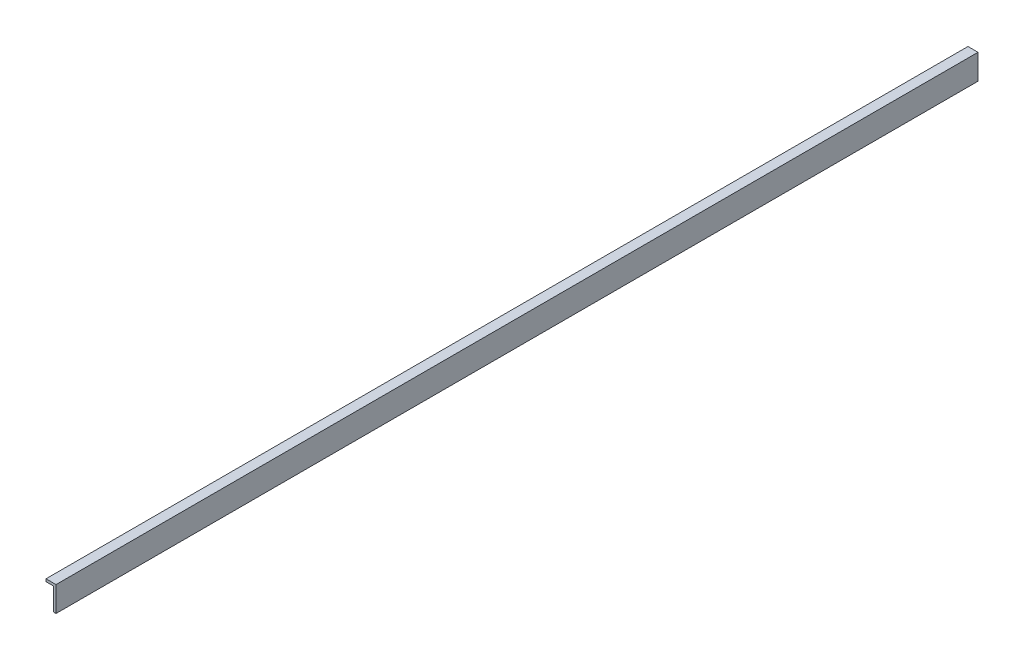
ISO-10303-21;
HEADER;
FILE_DESCRIPTION(('STEP AP214'),'2;1');
FILE_NAME('part.step','',(''),(''),'','','');
FILE_SCHEMA(('AUTOMOTIVE_DESIGN { 1 0 10303 214 1 1 1 1 }'));
ENDSEC;
DATA;
#1=APPLICATION_CONTEXT('core data for automotive mechanical design processes');
#2=APPLICATION_PROTOCOL_DEFINITION('international standard','automotive_design',2000,#1);
#3=PRODUCT_CONTEXT('',#1,'mechanical');
#4=PRODUCT('Part','Part','',(#3));
#5=PRODUCT_RELATED_PRODUCT_CATEGORY('part','',(#4));
#6=PRODUCT_DEFINITION_FORMATION('','',#4);
#7=PRODUCT_DEFINITION_CONTEXT('part definition',#1,'design');
#8=PRODUCT_DEFINITION('design','',#6,#7);
#9=PRODUCT_DEFINITION_SHAPE('','',#8);
#10=(LENGTH_UNIT() NAMED_UNIT(*) SI_UNIT(.MILLI.,.METRE.));
#11=(NAMED_UNIT(*) PLANE_ANGLE_UNIT() SI_UNIT($,.RADIAN.));
#12=(NAMED_UNIT(*) SI_UNIT($,.STERADIAN.) SOLID_ANGLE_UNIT());
#13=UNCERTAINTY_MEASURE_WITH_UNIT(LENGTH_MEASURE(1.E-05),#10,'distance_accuracy_value','');
#14=(GEOMETRIC_REPRESENTATION_CONTEXT(3) GLOBAL_UNCERTAINTY_ASSIGNED_CONTEXT((#13)) GLOBAL_UNIT_ASSIGNED_CONTEXT((#10,
#11,#12)) REPRESENTATION_CONTEXT('',''));
#15=CARTESIAN_POINT('',(0.,0.,0.));
#16=DIRECTION('',(0.,0.,1.));
#17=DIRECTION('',(1.,0.,0.));
#18=AXIS2_PLACEMENT_3D('',#15,#16,#17);
#19=CARTESIAN_POINT('',(649.5,422.5,-755.5));
#20=DIRECTION('',(-1.,0.,0.));
#21=DIRECTION('',(0.,0.,1.));
#22=AXIS2_PLACEMENT_3D('',#19,#20,#21);
#23=PLANE('',#22);
#24=DIRECTION('',(0.,-1.,0.));
#25=VECTOR('',#24,1.);
#26=CARTESIAN_POINT('',(649.5,422.5,-20.));
#27=LINE('',#26,#25);
#28=CARTESIAN_POINT('',(649.5,422.5,-20.));
#29=VERTEX_POINT('',#28);
#30=CARTESIAN_POINT('',(649.5,404.5,-20.));
#31=VERTEX_POINT('',#30);
#32=EDGE_CURVE('E124',#29,#31,#27,.T.);
#33=ORIENTED_EDGE('',*,*,#32,.F.);
#34=DIRECTION('',(0.,0.,1.));
#35=VECTOR('',#34,1.);
#36=CARTESIAN_POINT('',(649.5,422.5,-755.5));
#37=LINE('',#36,#35);
#38=CARTESIAN_POINT('',(649.5,422.5,-755.5));
#39=VERTEX_POINT('',#38);
#40=EDGE_CURVE('E11',#39,#29,#37,.T.);
#41=ORIENTED_EDGE('',*,*,#40,.F.);
#42=DIRECTION('',(0.,-1.,0.));
#43=VECTOR('',#42,1.);
#44=CARTESIAN_POINT('',(649.5,422.5,-755.5));
#45=LINE('',#44,#43);
#46=CARTESIAN_POINT('',(649.5,404.5,-755.5));
#47=VERTEX_POINT('',#46);
#48=EDGE_CURVE('E138',#39,#47,#45,.T.);
#49=ORIENTED_EDGE('',*,*,#48,.T.);
#50=DIRECTION('',(0.,0.,1.));
#51=VECTOR('',#50,1.);
#52=CARTESIAN_POINT('',(649.5,404.5,-755.5));
#53=LINE('',#52,#51);
#54=EDGE_CURVE('E42',#47,#31,#53,.T.);
#55=ORIENTED_EDGE('',*,*,#54,.T.);
#56=EDGE_LOOP('',(#33,#41,#49,#55));
#57=FACE_BOUND('',#56,.T.);
#58=ADVANCED_FACE('F39',(#57),#23,.T.);
#59=CARTESIAN_POINT('',(643.5,422.5,-755.5));
#60=DIRECTION('',(0.,-1.,0.));
#61=DIRECTION('',(0.,0.,-1.));
#62=AXIS2_PLACEMENT_3D('',#59,#60,#61);
#63=PLANE('',#62);
#64=DIRECTION('',(1.,0.,0.));
#65=VECTOR('',#64,1.);
#66=CARTESIAN_POINT('',(643.5,422.5,-20.));
#67=LINE('',#66,#65);
#68=CARTESIAN_POINT('',(643.5,422.5,-20.));
#69=VERTEX_POINT('',#68);
#70=EDGE_CURVE('E136',#69,#29,#67,.T.);
#71=ORIENTED_EDGE('',*,*,#70,.F.);
#72=DIRECTION('',(0.,0.,1.));
#73=VECTOR('',#72,1.);
#74=CARTESIAN_POINT('',(643.5,422.5,-755.5));
#75=LINE('',#74,#73);
#76=CARTESIAN_POINT('',(643.5,422.5,-755.5));
#77=VERTEX_POINT('',#76);
#78=EDGE_CURVE('E48',#77,#69,#75,.T.);
#79=ORIENTED_EDGE('',*,*,#78,.F.);
#80=DIRECTION('',(1.,0.,0.));
#81=VECTOR('',#80,1.);
#82=CARTESIAN_POINT('',(643.5,422.5,-755.5));
#83=LINE('',#82,#81);
#84=EDGE_CURVE('E114',#77,#39,#83,.T.);
#85=ORIENTED_EDGE('',*,*,#84,.T.);
#86=ORIENTED_EDGE('',*,*,#40,.T.);
#87=EDGE_LOOP('',(#71,#79,#85,#86));
#88=FACE_BOUND('',#87,.T.);
#89=ADVANCED_FACE('F146',(#88),#63,.T.);
#90=CARTESIAN_POINT('',(643.5,424.5,-755.5));
#91=DIRECTION('',(-1.,0.,0.));
#92=DIRECTION('',(0.,0.,1.));
#93=AXIS2_PLACEMENT_3D('',#90,#91,#92);
#94=PLANE('',#93);
#95=DIRECTION('',(0.,-1.,0.));
#96=VECTOR('',#95,1.);
#97=CARTESIAN_POINT('',(643.5,424.5,-20.));
#98=LINE('',#97,#96);
#99=CARTESIAN_POINT('',(643.5,424.5,-20.));
#100=VERTEX_POINT('',#99);
#101=EDGE_CURVE('E101',#100,#69,#98,.T.);
#102=ORIENTED_EDGE('',*,*,#101,.F.);
#103=DIRECTION('',(0.,0.,1.));
#104=VECTOR('',#103,1.);
#105=CARTESIAN_POINT('',(643.5,424.5,-755.5));
#106=LINE('',#105,#104);
#107=CARTESIAN_POINT('',(643.5,424.5,-755.5));
#108=VERTEX_POINT('',#107);
#109=EDGE_CURVE('E96',#108,#100,#106,.T.);
#110=ORIENTED_EDGE('',*,*,#109,.F.);
#111=DIRECTION('',(0.,-1.,0.));
#112=VECTOR('',#111,1.);
#113=CARTESIAN_POINT('',(643.5,424.5,-755.5));
#114=LINE('',#113,#112);
#115=EDGE_CURVE('E99',#108,#77,#114,.T.);
#116=ORIENTED_EDGE('',*,*,#115,.T.);
#117=ORIENTED_EDGE('',*,*,#78,.T.);
#118=EDGE_LOOP('',(#102,#110,#116,#117));
#119=FACE_BOUND('',#118,.T.);
#120=ADVANCED_FACE('F98',(#119),#94,.T.);
#121=CARTESIAN_POINT('',(651.5,424.5,-755.5));
#122=DIRECTION('',(0.,1.,0.));
#123=DIRECTION('',(0.,0.,1.));
#124=AXIS2_PLACEMENT_3D('',#121,#122,#123);
#125=PLANE('',#124);
#126=DIRECTION('',(-1.,0.,0.));
#127=VECTOR('',#126,1.);
#128=CARTESIAN_POINT('',(651.5,424.5,-20.));
#129=LINE('',#128,#127);
#130=CARTESIAN_POINT('',(651.5,424.5,-20.));
#131=VERTEX_POINT('',#130);
#132=EDGE_CURVE('E133',#131,#100,#129,.T.);
#133=ORIENTED_EDGE('',*,*,#132,.F.);
#134=DIRECTION('',(0.,0.,1.));
#135=VECTOR('',#134,1.);
#136=CARTESIAN_POINT('',(651.5,424.5,-755.5));
#137=LINE('',#136,#135);
#138=CARTESIAN_POINT('',(651.5,424.5,-755.5));
#139=VERTEX_POINT('',#138);
#140=EDGE_CURVE('E106',#139,#131,#137,.T.);
#141=ORIENTED_EDGE('',*,*,#140,.F.);
#142=DIRECTION('',(-1.,0.,0.));
#143=VECTOR('',#142,1.);
#144=CARTESIAN_POINT('',(651.5,424.5,-755.5));
#145=LINE('',#144,#143);
#146=EDGE_CURVE('E112',#139,#108,#145,.T.);
#147=ORIENTED_EDGE('',*,*,#146,.T.);
#148=ORIENTED_EDGE('',*,*,#109,.T.);
#149=EDGE_LOOP('',(#133,#141,#147,#148));
#150=FACE_BOUND('',#149,.T.);
#151=ADVANCED_FACE('F116',(#150),#125,.T.);
#152=CARTESIAN_POINT('',(651.5,404.5,-755.5));
#153=DIRECTION('',(1.,0.,0.));
#154=DIRECTION('',(0.,0.,-1.));
#155=AXIS2_PLACEMENT_3D('',#152,#153,#154);
#156=PLANE('',#155);
#157=DIRECTION('',(0.,1.,0.));
#158=VECTOR('',#157,1.);
#159=CARTESIAN_POINT('',(651.5,404.5,-20.));
#160=LINE('',#159,#158);
#161=CARTESIAN_POINT('',(651.5,404.5,-20.));
#162=VERTEX_POINT('',#161);
#163=EDGE_CURVE('E130',#162,#131,#160,.T.);
#164=ORIENTED_EDGE('',*,*,#163,.F.);
#165=DIRECTION('',(0.,0.,1.));
#166=VECTOR('',#165,1.);
#167=CARTESIAN_POINT('',(651.5,404.5,-755.5));
#168=LINE('',#167,#166);
#169=CARTESIAN_POINT('',(651.5,404.5,-755.5));
#170=VERTEX_POINT('',#169);
#171=EDGE_CURVE('E141',#170,#162,#168,.T.);
#172=ORIENTED_EDGE('',*,*,#171,.F.);
#173=DIRECTION('',(0.,1.,0.));
#174=VECTOR('',#173,1.);
#175=CARTESIAN_POINT('',(651.5,404.5,-755.5));
#176=LINE('',#175,#174);
#177=EDGE_CURVE('E117',#170,#139,#176,.T.);
#178=ORIENTED_EDGE('',*,*,#177,.T.);
#179=ORIENTED_EDGE('',*,*,#140,.T.);
#180=EDGE_LOOP('',(#164,#172,#178,#179));
#181=FACE_BOUND('',#180,.T.);
#182=ADVANCED_FACE('F159',(#181),#156,.T.);
#183=CARTESIAN_POINT('',(649.5,404.5,-755.5));
#184=DIRECTION('',(0.,-1.,0.));
#185=DIRECTION('',(0.,0.,-1.));
#186=AXIS2_PLACEMENT_3D('',#183,#184,#185);
#187=PLANE('',#186);
#188=DIRECTION('',(1.,0.,0.));
#189=VECTOR('',#188,1.);
#190=CARTESIAN_POINT('',(649.5,404.5,-20.));
#191=LINE('',#190,#189);
#192=EDGE_CURVE('E127',#31,#162,#191,.T.);
#193=ORIENTED_EDGE('',*,*,#192,.F.);
#194=ORIENTED_EDGE('',*,*,#54,.F.);
#195=DIRECTION('',(1.,0.,0.));
#196=VECTOR('',#195,1.);
#197=CARTESIAN_POINT('',(649.5,404.5,-755.5));
#198=LINE('',#197,#196);
#199=EDGE_CURVE('E119',#47,#170,#198,.T.);
#200=ORIENTED_EDGE('',*,*,#199,.T.);
#201=ORIENTED_EDGE('',*,*,#171,.T.);
#202=EDGE_LOOP('',(#193,#194,#200,#201));
#203=FACE_BOUND('',#202,.T.);
#204=ADVANCED_FACE('F143',(#203),#187,.T.);
#205=CARTESIAN_POINT('',(0.,0.,-755.5));
#206=DIRECTION('',(0.,0.,1.));
#207=DIRECTION('',(1.,0.,0.));
#208=AXIS2_PLACEMENT_3D('',#205,#206,#207);
#209=PLANE('',#208);
#210=ORIENTED_EDGE('',*,*,#48,.F.);
#211=ORIENTED_EDGE('',*,*,#84,.F.);
#212=ORIENTED_EDGE('',*,*,#115,.F.);
#213=ORIENTED_EDGE('',*,*,#146,.F.);
#214=ORIENTED_EDGE('',*,*,#177,.F.);
#215=ORIENTED_EDGE('',*,*,#199,.F.);
#216=EDGE_LOOP('',(#210,#211,#212,#213,#214,#215));
#217=FACE_BOUND('',#216,.T.);
#218=ADVANCED_FACE('F110',(#217),#209,.F.);
#219=CARTESIAN_POINT('',(0.,0.,-20.));
#220=DIRECTION('',(0.,0.,1.));
#221=DIRECTION('',(1.,0.,0.));
#222=AXIS2_PLACEMENT_3D('',#219,#220,#221);
#223=PLANE('',#222);
#224=ORIENTED_EDGE('',*,*,#32,.T.);
#225=ORIENTED_EDGE('',*,*,#192,.T.);
#226=ORIENTED_EDGE('',*,*,#163,.T.);
#227=ORIENTED_EDGE('',*,*,#132,.T.);
#228=ORIENTED_EDGE('',*,*,#101,.T.);
#229=ORIENTED_EDGE('',*,*,#70,.T.);
#230=EDGE_LOOP('',(#224,#225,#226,#227,#228,#229));
#231=FACE_BOUND('',#230,.T.);
#232=ADVANCED_FACE('F145',(#231),#223,.T.);
#233=CLOSED_SHELL('',(#58,#89,#120,#151,#182,#204,#218,#232));
#234=MANIFOLD_SOLID_BREP('B2',#233);
#235=ADVANCED_BREP_SHAPE_REPRESENTATION('',(#18,#234),#14);
#236=SHAPE_DEFINITION_REPRESENTATION(#9,#235);
ENDSEC;
END-ISO-10303-21;
